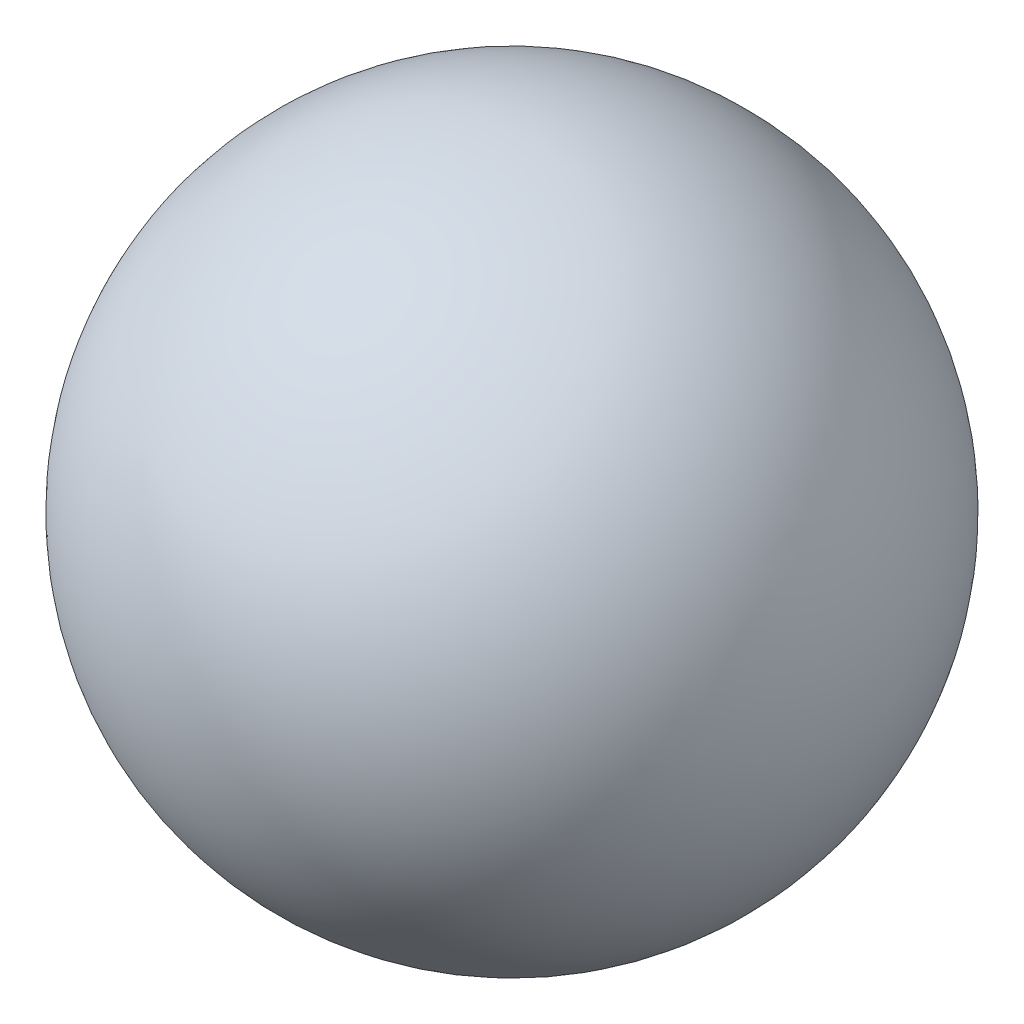
ISO-10303-21;
HEADER;
FILE_DESCRIPTION(('STEP AP214'),'2;1');
FILE_NAME('part.step','',(''),(''),'','','');
FILE_SCHEMA(('AUTOMOTIVE_DESIGN { 1 0 10303 214 1 1 1 1 }'));
ENDSEC;
DATA;
#1=APPLICATION_CONTEXT('core data for automotive mechanical design processes');
#2=APPLICATION_PROTOCOL_DEFINITION('international standard','automotive_design',2000,#1);
#3=PRODUCT_CONTEXT('',#1,'mechanical');
#4=PRODUCT('Part','Part','',(#3));
#5=PRODUCT_RELATED_PRODUCT_CATEGORY('part','',(#4));
#6=PRODUCT_DEFINITION_FORMATION('','',#4);
#7=PRODUCT_DEFINITION_CONTEXT('part definition',#1,'design');
#8=PRODUCT_DEFINITION('design','',#6,#7);
#9=PRODUCT_DEFINITION_SHAPE('','',#8);
#10=(LENGTH_UNIT() NAMED_UNIT(*) SI_UNIT(.MILLI.,.METRE.));
#11=(NAMED_UNIT(*) PLANE_ANGLE_UNIT() SI_UNIT($,.RADIAN.));
#12=(NAMED_UNIT(*) SI_UNIT($,.STERADIAN.) SOLID_ANGLE_UNIT());
#13=UNCERTAINTY_MEASURE_WITH_UNIT(LENGTH_MEASURE(1.E-05),#10,'distance_accuracy_value','');
#14=(GEOMETRIC_REPRESENTATION_CONTEXT(3) GLOBAL_UNCERTAINTY_ASSIGNED_CONTEXT((#13)) GLOBAL_UNIT_ASSIGNED_CONTEXT((#10,
#11,#12)) REPRESENTATION_CONTEXT('',''));
#15=CARTESIAN_POINT('',(0.,0.,0.));
#16=DIRECTION('',(0.,0.,1.));
#17=DIRECTION('',(1.,0.,0.));
#18=AXIS2_PLACEMENT_3D('',#15,#16,#17);
#19=CARTESIAN_POINT('',(0.,0.,0.));
#20=DIRECTION('',(-1.,0.,0.));
#21=DIRECTION('',(0.,1.,0.));
#22=AXIS2_PLACEMENT_3D('',#19,#20,#21);
#23=SPHERICAL_SURFACE('',#22,4.2);
#24=CARTESIAN_POINT('',(-4.2,0.,0.));
#25=VERTEX_POINT('',#24);
#26=VERTEX_LOOP('',#25);
#27=FACE_BOUND('',#26,.T.);
#28=ADVANCED_FACE('F36',(#27),#23,.T.);
#29=CLOSED_SHELL('',(#28));
#30=MANIFOLD_SOLID_BREP('B2',#29);
#31=ADVANCED_BREP_SHAPE_REPRESENTATION('',(#18,#30),#14);
#32=SHAPE_DEFINITION_REPRESENTATION(#9,#31);
ENDSEC;
END-ISO-10303-21;
